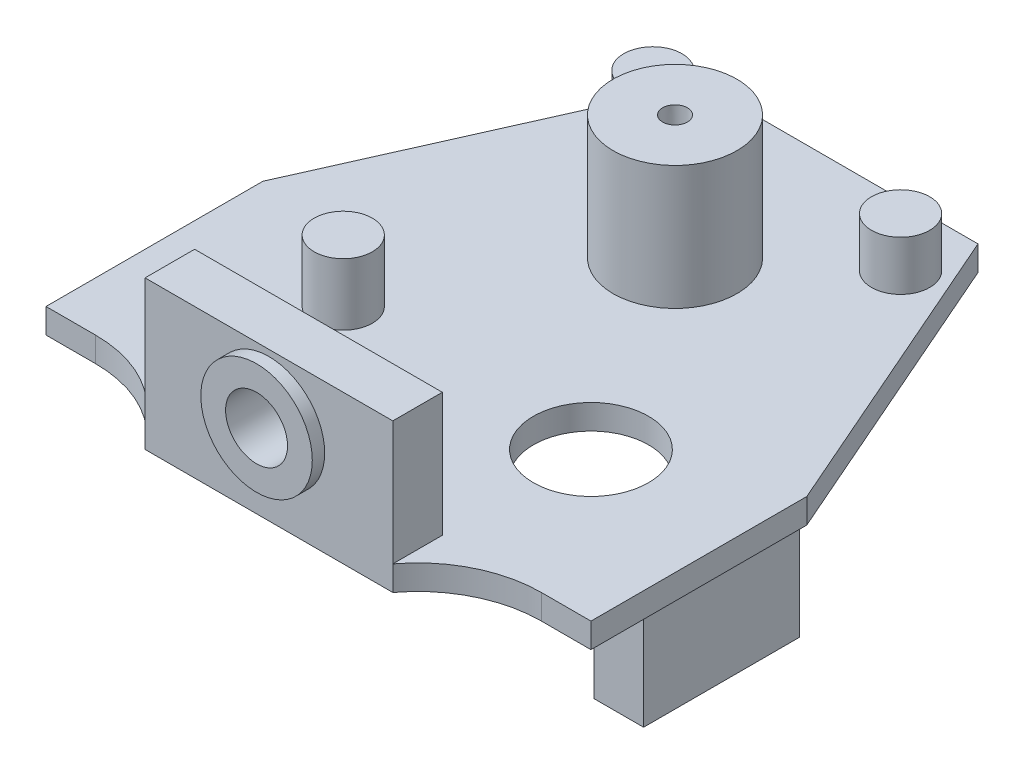
ISO-10303-21;
HEADER;
FILE_DESCRIPTION(('STEP AP214'),'2;1');
FILE_NAME('part.step','',(''),(''),'','','');
FILE_SCHEMA(('AUTOMOTIVE_DESIGN { 1 0 10303 214 1 1 1 1 }'));
ENDSEC;
DATA;
#1=APPLICATION_CONTEXT('core data for automotive mechanical design processes');
#2=APPLICATION_PROTOCOL_DEFINITION('international standard','automotive_design',2000,#1);
#3=PRODUCT_CONTEXT('',#1,'mechanical');
#4=PRODUCT('Part','Part','',(#3));
#5=PRODUCT_RELATED_PRODUCT_CATEGORY('part','',(#4));
#6=PRODUCT_DEFINITION_FORMATION('','',#4);
#7=PRODUCT_DEFINITION_CONTEXT('part definition',#1,'design');
#8=PRODUCT_DEFINITION('design','',#6,#7);
#9=PRODUCT_DEFINITION_SHAPE('','',#8);
#10=(LENGTH_UNIT() NAMED_UNIT(*) SI_UNIT(.MILLI.,.METRE.));
#11=(NAMED_UNIT(*) PLANE_ANGLE_UNIT() SI_UNIT($,.RADIAN.));
#12=(NAMED_UNIT(*) SI_UNIT($,.STERADIAN.) SOLID_ANGLE_UNIT());
#13=UNCERTAINTY_MEASURE_WITH_UNIT(LENGTH_MEASURE(1.E-05),#10,'distance_accuracy_value','');
#14=(GEOMETRIC_REPRESENTATION_CONTEXT(3) GLOBAL_UNCERTAINTY_ASSIGNED_CONTEXT((#13)) GLOBAL_UNIT_ASSIGNED_CONTEXT((#10,
#11,#12)) REPRESENTATION_CONTEXT('',''));
#15=CARTESIAN_POINT('',(0.,0.,0.));
#16=DIRECTION('',(0.,0.,1.));
#17=DIRECTION('',(1.,0.,0.));
#18=AXIS2_PLACEMENT_3D('',#15,#16,#17);
#19=CARTESIAN_POINT('',(0.,0.,16.));
#20=DIRECTION('',(0.,0.,1.));
#21=DIRECTION('',(1.,0.,0.));
#22=AXIS2_PLACEMENT_3D('',#19,#20,#21);
#23=PLANE('',#22);
#24=DIRECTION('',(0.,-1.,0.));
#25=VECTOR('',#24,1.);
#26=CARTESIAN_POINT('',(-10.,2.,16.));
#27=LINE('',#26,#25);
#28=CARTESIAN_POINT('',(-10.,12.,16.));
#29=VERTEX_POINT('',#28);
#30=CARTESIAN_POINT('',(-10.,2.,16.));
#31=VERTEX_POINT('',#30);
#32=EDGE_CURVE('E183',#29,#31,#27,.T.);
#33=ORIENTED_EDGE('',*,*,#32,.T.);
#34=CARTESIAN_POINT('',(-10.,0.,16.));
#35=VERTEX_POINT('',#34);
#36=EDGE_CURVE('E192',#31,#35,#27,.T.);
#37=ORIENTED_EDGE('',*,*,#36,.T.);
#38=DIRECTION('',(1.,0.,0.));
#39=VECTOR('',#38,1.);
#40=CARTESIAN_POINT('',(-10.,0.,16.));
#41=LINE('',#40,#39);
#42=CARTESIAN_POINT('',(10.,0.,16.));
#43=VERTEX_POINT('',#42);
#44=EDGE_CURVE('E191',#35,#43,#41,.T.);
#45=ORIENTED_EDGE('',*,*,#44,.T.);
#46=DIRECTION('',(0.,1.,0.));
#47=VECTOR('',#46,1.);
#48=CARTESIAN_POINT('',(10.,2.,16.));
#49=LINE('',#48,#47);
#50=CARTESIAN_POINT('',(10.,2.,16.));
#51=VERTEX_POINT('',#50);
#52=EDGE_CURVE('E225',#43,#51,#49,.T.);
#53=ORIENTED_EDGE('',*,*,#52,.T.);
#54=CARTESIAN_POINT('',(10.,12.,16.));
#55=VERTEX_POINT('',#54);
#56=EDGE_CURVE('E199',#51,#55,#49,.T.);
#57=ORIENTED_EDGE('',*,*,#56,.T.);
#58=DIRECTION('',(1.,0.,0.));
#59=VECTOR('',#58,1.);
#60=CARTESIAN_POINT('',(-10.,12.,16.));
#61=LINE('',#60,#59);
#62=EDGE_CURVE('E195',#29,#55,#61,.T.);
#63=ORIENTED_EDGE('',*,*,#62,.F.);
#64=EDGE_LOOP('',(#33,#37,#45,#53,#57,#63));
#65=FACE_BOUND('',#64,.T.);
#66=CARTESIAN_POINT('',(0.,7.,16.));
#67=DIRECTION('',(0.,0.,1.));
#68=DIRECTION('',(1.,0.,0.));
#69=AXIS2_PLACEMENT_3D('',#66,#67,#68);
#70=CIRCLE('',#69,4.5);
#71=CARTESIAN_POINT('',(4.5,7.,16.));
#72=VERTEX_POINT('',#71);
#73=EDGE_CURVE('E817',#72,#72,#70,.T.);
#74=ORIENTED_EDGE('',*,*,#73,.F.);
#75=EDGE_LOOP('',(#74));
#76=FACE_BOUND('',#75,.T.);
#77=ADVANCED_FACE('F39',(#65,#76),#23,.T.);
#78=CARTESIAN_POINT('',(0.,7.,16.));
#79=DIRECTION('',(0.,0.,-1.));
#80=DIRECTION('',(-1.,0.,0.));
#81=AXIS2_PLACEMENT_3D('',#78,#79,#80);
#82=CYLINDRICAL_SURFACE('',#81,1.);
#83=CARTESIAN_POINT('',(0.,7.,12.));
#84=DIRECTION('',(0.,0.,-1.));
#85=DIRECTION('',(-1.,0.,0.));
#86=AXIS2_PLACEMENT_3D('',#83,#84,#85);
#87=CIRCLE('',#86,1.);
#88=CARTESIAN_POINT('',(-1.,7.,12.));
#89=VERTEX_POINT('',#88);
#90=EDGE_CURVE('E211',#89,#89,#87,.T.);
#91=ORIENTED_EDGE('',*,*,#90,.T.);
#92=EDGE_LOOP('',(#91));
#93=FACE_BOUND('',#92,.T.);
#94=CARTESIAN_POINT('',(0.,7.,13.));
#95=DIRECTION('',(0.,0.,1.));
#96=DIRECTION('',(1.,0.,0.));
#97=AXIS2_PLACEMENT_3D('',#94,#95,#96);
#98=CIRCLE('',#97,1.);
#99=CARTESIAN_POINT('',(0.999999999999998,7.,13.));
#100=VERTEX_POINT('',#99);
#101=EDGE_CURVE('E43',#100,#100,#98,.F.);
#102=ORIENTED_EDGE('',*,*,#101,.F.);
#103=EDGE_LOOP('',(#102));
#104=FACE_BOUND('',#103,.T.);
#105=ADVANCED_FACE('F432',(#93,#104),#82,.F.);
#106=CARTESIAN_POINT('',(0.,2.,0.));
#107=DIRECTION('',(0.,1.,0.));
#108=DIRECTION('',(0.,0.,1.));
#109=AXIS2_PLACEMENT_3D('',#106,#107,#108);
#110=PLANE('',#109);
#111=CARTESIAN_POINT('',(0.,2.,-16.7877513366981));
#112=DIRECTION('',(0.,1.,0.));
#113=DIRECTION('',(0.,0.,1.));
#114=AXIS2_PLACEMENT_3D('',#111,#112,#113);
#115=CIRCLE('',#114,5.);
#116=CARTESIAN_POINT('',(0.,2.,-11.7877513366981));
#117=VERTEX_POINT('',#116);
#118=EDGE_CURVE('E311',#117,#117,#115,.T.);
#119=ORIENTED_EDGE('',*,*,#118,.F.);
#120=EDGE_LOOP('',(#119));
#121=FACE_BOUND('',#120,.T.);
#122=CARTESIAN_POINT('',(-10.,2.,0.));
#123=DIRECTION('',(0.,1.,0.));
#124=DIRECTION('',(0.,0.,1.));
#125=AXIS2_PLACEMENT_3D('',#122,#123,#124);
#126=CIRCLE('',#125,2.35);
#127=CARTESIAN_POINT('',(-10.,2.,2.35));
#128=VERTEX_POINT('',#127);
#129=EDGE_CURVE('E340',#128,#128,#126,.T.);
#130=ORIENTED_EDGE('',*,*,#129,.F.);
#131=EDGE_LOOP('',(#130));
#132=FACE_BOUND('',#131,.T.);
#133=CARTESIAN_POINT('',(10.,2.,0.));
#134=DIRECTION('',(0.,1.,0.));
#135=DIRECTION('',(0.,0.,1.));
#136=AXIS2_PLACEMENT_3D('',#133,#134,#135);
#137=CIRCLE('',#136,4.65);
#138=CARTESIAN_POINT('',(10.,2.,4.65));
#139=VERTEX_POINT('',#138);
#140=EDGE_CURVE('E362',#139,#139,#137,.T.);
#141=ORIENTED_EDGE('',*,*,#140,.F.);
#142=EDGE_LOOP('',(#141));
#143=FACE_BOUND('',#142,.T.);
#144=CARTESIAN_POINT('',(10.,2.,-25.));
#145=DIRECTION('',(0.,1.,0.));
#146=DIRECTION('',(0.,0.,1.));
#147=AXIS2_PLACEMENT_3D('',#144,#145,#146);
#148=CIRCLE('',#147,2.35);
#149=CARTESIAN_POINT('',(10.,2.,-22.65));
#150=VERTEX_POINT('',#149);
#151=EDGE_CURVE('E376',#150,#150,#148,.T.);
#152=ORIENTED_EDGE('',*,*,#151,.F.);
#153=EDGE_LOOP('',(#152));
#154=FACE_BOUND('',#153,.T.);
#155=CARTESIAN_POINT('',(-10.,2.,-25.));
#156=DIRECTION('',(0.,1.,0.));
#157=DIRECTION('',(0.,0.,1.));
#158=AXIS2_PLACEMENT_3D('',#155,#156,#157);
#159=CIRCLE('',#158,2.35);
#160=CARTESIAN_POINT('',(-10.,2.,-22.65));
#161=VERTEX_POINT('',#160);
#162=EDGE_CURVE('E375',#161,#161,#159,.T.);
#163=ORIENTED_EDGE('',*,*,#162,.F.);
#164=EDGE_LOOP('',(#163));
#165=FACE_BOUND('',#164,.T.);
#166=DIRECTION('',(1.,0.,0.));
#167=VECTOR('',#166,1.);
#168=CARTESIAN_POINT('',(20.,2.,12.));
#169=LINE('',#168,#167);
#170=CARTESIAN_POINT('',(-22.,2.,12.));
#171=VERTEX_POINT('',#170);
#172=CARTESIAN_POINT('',(-18.,2.,12.));
#173=VERTEX_POINT('',#172);
#174=EDGE_CURVE('E332',#171,#173,#169,.T.);
#175=ORIENTED_EDGE('',*,*,#174,.T.);
#176=CARTESIAN_POINT('',(-18.,2.,22.));
#177=DIRECTION('',(0.,1.,0.));
#178=DIRECTION('',(0.,0.,1.));
#179=AXIS2_PLACEMENT_3D('',#176,#177,#178);
#180=CIRCLE('',#179,10.);
#181=EDGE_CURVE('E11',#173,#31,#180,.F.);
#182=ORIENTED_EDGE('',*,*,#181,.T.);
#183=DIRECTION('',(0.,0.,1.));
#184=VECTOR('',#183,1.);
#185=CARTESIAN_POINT('',(-10.,2.,16.));
#186=LINE('',#185,#184);
#187=CARTESIAN_POINT('',(-10.,2.,12.));
#188=VERTEX_POINT('',#187);
#189=EDGE_CURVE('E54',#188,#31,#186,.T.);
#190=ORIENTED_EDGE('',*,*,#189,.F.);
#191=DIRECTION('',(-1.,0.,0.));
#192=VECTOR('',#191,1.);
#193=CARTESIAN_POINT('',(-10.,2.,12.));
#194=LINE('',#193,#192);
#195=CARTESIAN_POINT('',(10.,2.,12.));
#196=VERTEX_POINT('',#195);
#197=EDGE_CURVE('E208',#196,#188,#194,.T.);
#198=ORIENTED_EDGE('',*,*,#197,.F.);
#199=DIRECTION('',(0.,0.,-1.));
#200=VECTOR('',#199,1.);
#201=CARTESIAN_POINT('',(10.,2.,16.));
#202=LINE('',#201,#200);
#203=EDGE_CURVE('E388',#51,#196,#202,.T.);
#204=ORIENTED_EDGE('',*,*,#203,.F.);
#205=CARTESIAN_POINT('',(18.,2.,22.));
#206=DIRECTION('',(0.,1.,0.));
#207=DIRECTION('',(0.,0.,1.));
#208=AXIS2_PLACEMENT_3D('',#205,#206,#207);
#209=CIRCLE('',#208,10.);
#210=CARTESIAN_POINT('',(18.,2.,12.));
#211=VERTEX_POINT('',#210);
#212=EDGE_CURVE('E399',#51,#211,#209,.F.);
#213=ORIENTED_EDGE('',*,*,#212,.T.);
#214=CARTESIAN_POINT('',(22.,2.,12.));
#215=VERTEX_POINT('',#214);
#216=EDGE_CURVE('E331',#211,#215,#169,.T.);
#217=ORIENTED_EDGE('',*,*,#216,.T.);
#218=DIRECTION('',(0.,0.,-1.));
#219=VECTOR('',#218,1.);
#220=CARTESIAN_POINT('',(22.,2.,-5.42857142857232));
#221=LINE('',#220,#219);
#222=CARTESIAN_POINT('',(22.,2.,-5.42857142857232));
#223=VERTEX_POINT('',#222);
#224=EDGE_CURVE('E322',#215,#223,#221,.T.);
#225=ORIENTED_EDGE('',*,*,#224,.T.);
#226=DIRECTION('',(0.400818834019773,0.,0.91615733490216));
#227=VECTOR('',#226,1.);
#228=CARTESIAN_POINT('',(20.,2.,-10.));
#229=LINE('',#228,#227);
#230=CARTESIAN_POINT('',(11.2499999999983,2.,-30.));
#231=VERTEX_POINT('',#230);
#232=EDGE_CURVE('E358',#231,#223,#229,.T.);
#233=ORIENTED_EDGE('',*,*,#232,.F.);
#234=DIRECTION('',(-1.,0.,0.));
#235=VECTOR('',#234,1.);
#236=CARTESIAN_POINT('',(-20.,2.,-30.));
#237=LINE('',#236,#235);
#238=CARTESIAN_POINT('',(-11.1,2.,-30.));
#239=VERTEX_POINT('',#238);
#240=EDGE_CURVE('E382',#231,#239,#237,.T.);
#241=ORIENTED_EDGE('',*,*,#240,.T.);
#242=DIRECTION('',(0.406562268123199,0.,-0.913623074434156));
#243=VECTOR('',#242,1.);
#244=CARTESIAN_POINT('',(-11.1,2.,-30.));
#245=LINE('',#244,#243);
#246=CARTESIAN_POINT('',(-22.,2.,-5.505617977528));
#247=VERTEX_POINT('',#246);
#248=EDGE_CURVE('E352',#247,#239,#245,.T.);
#249=ORIENTED_EDGE('',*,*,#248,.F.);
#250=DIRECTION('',(0.,0.,1.));
#251=VECTOR('',#250,1.);
#252=CARTESIAN_POINT('',(-22.,2.,-5.505617977528));
#253=LINE('',#252,#251);
#254=EDGE_CURVE('E315',#247,#171,#253,.T.);
#255=ORIENTED_EDGE('',*,*,#254,.T.);
#256=EDGE_LOOP('',(#175,#182,#190,#198,#204,#213,#217,#225,#233,#241,#249,#255));
#257=FACE_BOUND('',#256,.T.);
#258=ADVANCED_FACE('F414',(#121,#132,#143,#154,#165,#257),#110,.T.);
#259=CARTESIAN_POINT('',(20.,0.,12.));
#260=DIRECTION('',(0.,0.,1.));
#261=DIRECTION('',(1.,0.,0.));
#262=AXIS2_PLACEMENT_3D('',#259,#260,#261);
#263=PLANE('',#262);
#264=DIRECTION('',(1.,0.,0.));
#265=VECTOR('',#264,1.);
#266=CARTESIAN_POINT('',(-20.,0.,12.));
#267=LINE('',#266,#265);
#268=CARTESIAN_POINT('',(-22.,0.,12.));
#269=VERTEX_POINT('',#268);
#270=CARTESIAN_POINT('',(-18.,0.,12.));
#271=VERTEX_POINT('',#270);
#272=EDGE_CURVE('E323',#269,#271,#267,.T.);
#273=ORIENTED_EDGE('',*,*,#272,.T.);
#274=DIRECTION('',(0.,1.,0.));
#275=VECTOR('',#274,1.);
#276=CARTESIAN_POINT('',(-18.,2.,12.));
#277=LINE('',#276,#275);
#278=EDGE_CURVE('E397',#271,#173,#277,.T.);
#279=ORIENTED_EDGE('',*,*,#278,.T.);
#280=ORIENTED_EDGE('',*,*,#174,.F.);
#281=DIRECTION('',(0.,1.,0.));
#282=VECTOR('',#281,1.);
#283=CARTESIAN_POINT('',(-22.,0.,12.));
#284=LINE('',#283,#282);
#285=EDGE_CURVE('E344',#269,#171,#284,.T.);
#286=ORIENTED_EDGE('',*,*,#285,.F.);
#287=EDGE_LOOP('',(#273,#279,#280,#286));
#288=FACE_BOUND('',#287,.T.);
#289=ADVANCED_FACE('F523',(#288),#263,.T.);
#290=CARTESIAN_POINT('',(0.,0.,0.));
#291=DIRECTION('',(0.,1.,0.));
#292=DIRECTION('',(0.,0.,1.));
#293=AXIS2_PLACEMENT_3D('',#290,#291,#292);
#294=PLANE('',#293);
#295=DIRECTION('',(0.,0.,-1.));
#296=VECTOR('',#295,1.);
#297=CARTESIAN_POINT('',(-11.5499999999692,0.,6.29999999998945));
#298=LINE('',#297,#296);
#299=CARTESIAN_POINT('',(-11.5499999999692,0.,6.29999999998945));
#300=VERTEX_POINT('',#299);
#301=CARTESIAN_POINT('',(-11.5499999999692,0.,-6.30000000001055));
#302=VERTEX_POINT('',#301);
#303=EDGE_CURVE('E272',#300,#302,#298,.T.);
#304=ORIENTED_EDGE('',*,*,#303,.F.);
#305=DIRECTION('',(-1.,0.,0.));
#306=VECTOR('',#305,1.);
#307=CARTESIAN_POINT('',(-11.5499999999692,0.,6.29999999998945));
#308=LINE('',#307,#306);
#309=CARTESIAN_POINT('',(-7.54999999996917,0.,6.29999999998945));
#310=VERTEX_POINT('',#309);
#311=EDGE_CURVE('E277',#310,#300,#308,.T.);
#312=ORIENTED_EDGE('',*,*,#311,.F.);
#313=DIRECTION('',(0.,0.,1.));
#314=VECTOR('',#313,1.);
#315=CARTESIAN_POINT('',(-7.54999999996917,0.,6.29999999998945));
#316=LINE('',#315,#314);
#317=CARTESIAN_POINT('',(-7.54999999996917,0.,-6.30000000001055));
#318=VERTEX_POINT('',#317);
#319=EDGE_CURVE('E289',#318,#310,#316,.T.);
#320=ORIENTED_EDGE('',*,*,#319,.F.);
#321=DIRECTION('',(1.,0.,0.));
#322=VECTOR('',#321,1.);
#323=CARTESIAN_POINT('',(-11.5499999999692,0.,-6.30000000001055));
#324=LINE('',#323,#322);
#325=EDGE_CURVE('E286',#302,#318,#324,.T.);
#326=ORIENTED_EDGE('',*,*,#325,.F.);
#327=EDGE_LOOP('',(#304,#312,#320,#326));
#328=FACE_BOUND('',#327,.T.);
#329=DIRECTION('',(0.400818834019773,0.,0.91615733490216));
#330=VECTOR('',#329,1.);
#331=CARTESIAN_POINT('',(20.,0.,-10.));
#332=LINE('',#331,#330);
#333=CARTESIAN_POINT('',(11.2499999999983,0.,-30.));
#334=VERTEX_POINT('',#333);
#335=CARTESIAN_POINT('',(22.,0.,-5.42857142857232));
#336=VERTEX_POINT('',#335);
#337=EDGE_CURVE('E355',#334,#336,#332,.T.);
#338=ORIENTED_EDGE('',*,*,#337,.T.);
#339=DIRECTION('',(0.,0.,-1.));
#340=VECTOR('',#339,1.);
#341=CARTESIAN_POINT('',(22.,0.,-5.42857142857232));
#342=LINE('',#341,#340);
#343=CARTESIAN_POINT('',(22.,0.,12.));
#344=VERTEX_POINT('',#343);
#345=EDGE_CURVE('E325',#344,#336,#342,.T.);
#346=ORIENTED_EDGE('',*,*,#345,.F.);
#347=CARTESIAN_POINT('',(18.,0.,12.));
#348=VERTEX_POINT('',#347);
#349=EDGE_CURVE('E321',#348,#344,#267,.T.);
#350=ORIENTED_EDGE('',*,*,#349,.F.);
#351=CARTESIAN_POINT('',(18.,0.,22.));
#352=DIRECTION('',(0.,1.,0.));
#353=DIRECTION('',(0.,0.,1.));
#354=AXIS2_PLACEMENT_3D('',#351,#352,#353);
#355=CIRCLE('',#354,10.);
#356=EDGE_CURVE('E401',#348,#43,#355,.T.);
#357=ORIENTED_EDGE('',*,*,#356,.T.);
#358=ORIENTED_EDGE('',*,*,#44,.F.);
#359=CARTESIAN_POINT('',(-18.,0.,22.));
#360=DIRECTION('',(0.,1.,0.));
#361=DIRECTION('',(0.,0.,1.));
#362=AXIS2_PLACEMENT_3D('',#359,#360,#361);
#363=CIRCLE('',#362,10.);
#364=EDGE_CURVE('E48',#35,#271,#363,.T.);
#365=ORIENTED_EDGE('',*,*,#364,.T.);
#366=ORIENTED_EDGE('',*,*,#272,.F.);
#367=DIRECTION('',(0.,0.,1.));
#368=VECTOR('',#367,1.);
#369=CARTESIAN_POINT('',(-22.,0.,-5.505617977528));
#370=LINE('',#369,#368);
#371=CARTESIAN_POINT('',(-22.,0.,-5.505617977528));
#372=VERTEX_POINT('',#371);
#373=EDGE_CURVE('E318',#372,#269,#370,.T.);
#374=ORIENTED_EDGE('',*,*,#373,.F.);
#375=DIRECTION('',(0.406562268123199,0.,-0.913623074434156));
#376=VECTOR('',#375,1.);
#377=CARTESIAN_POINT('',(-11.1,0.,-30.));
#378=LINE('',#377,#376);
#379=CARTESIAN_POINT('',(-11.1,0.,-30.));
#380=VERTEX_POINT('',#379);
#381=EDGE_CURVE('E363',#372,#380,#378,.T.);
#382=ORIENTED_EDGE('',*,*,#381,.T.);
#383=DIRECTION('',(-1.,0.,0.));
#384=VECTOR('',#383,1.);
#385=CARTESIAN_POINT('',(-20.,0.,-30.));
#386=LINE('',#385,#384);
#387=EDGE_CURVE('E385',#334,#380,#386,.T.);
#388=ORIENTED_EDGE('',*,*,#387,.F.);
#389=EDGE_LOOP('',(#338,#346,#350,#357,#358,#365,#366,#374,#382,#388));
#390=FACE_BOUND('',#389,.T.);
#391=CARTESIAN_POINT('',(10.,0.,0.));
#392=DIRECTION('',(0.,1.,0.));
#393=DIRECTION('',(0.,0.,1.));
#394=AXIS2_PLACEMENT_3D('',#391,#392,#393);
#395=CIRCLE('',#394,4.65);
#396=CARTESIAN_POINT('',(10.,0.,4.65));
#397=VERTEX_POINT('',#396);
#398=EDGE_CURVE('E371',#397,#397,#395,.T.);
#399=ORIENTED_EDGE('',*,*,#398,.T.);
#400=EDGE_LOOP('',(#399));
#401=FACE_BOUND('',#400,.T.);
#402=DIRECTION('',(0.,0.,1.));
#403=VECTOR('',#402,1.);
#404=CARTESIAN_POINT('',(20.5499999972739,0.,6.3001583617975));
#405=LINE('',#404,#403);
#406=CARTESIAN_POINT('',(20.5499999972739,0.,-6.29998085737452));
#407=VERTEX_POINT('',#406);
#408=CARTESIAN_POINT('',(20.5499999972739,0.,6.3001583617975));
#409=VERTEX_POINT('',#408);
#410=EDGE_CURVE('E235',#407,#409,#405,.T.);
#411=ORIENTED_EDGE('',*,*,#410,.F.);
#412=DIRECTION('',(1.,0.,0.));
#413=VECTOR('',#412,1.);
#414=CARTESIAN_POINT('',(20.5499999972739,0.,-6.29998085737452));
#415=LINE('',#414,#413);
#416=CARTESIAN_POINT('',(16.5499999972739,0.,-6.29998085737452));
#417=VERTEX_POINT('',#416);
#418=EDGE_CURVE('E244',#417,#407,#415,.T.);
#419=ORIENTED_EDGE('',*,*,#418,.F.);
#420=DIRECTION('',(0.,0.,-1.));
#421=VECTOR('',#420,1.);
#422=CARTESIAN_POINT('',(16.5499999972739,0.,6.3001583617975));
#423=LINE('',#422,#421);
#424=CARTESIAN_POINT('',(16.5499999972739,0.,6.3001583617975));
#425=VERTEX_POINT('',#424);
#426=EDGE_CURVE('E256',#425,#417,#423,.T.);
#427=ORIENTED_EDGE('',*,*,#426,.F.);
#428=DIRECTION('',(-1.,0.,0.));
#429=VECTOR('',#428,1.);
#430=CARTESIAN_POINT('',(20.5499999972739,0.,6.3001583617975));
#431=LINE('',#430,#429);
#432=EDGE_CURVE('E253',#409,#425,#431,.T.);
#433=ORIENTED_EDGE('',*,*,#432,.F.);
#434=EDGE_LOOP('',(#411,#419,#427,#433));
#435=FACE_BOUND('',#434,.T.);
#436=ADVANCED_FACE('F405',(#328,#390,#401,#435),#294,.F.);
#437=CARTESIAN_POINT('',(-20.,0.,-30.));
#438=DIRECTION('',(0.,0.,-1.));
#439=DIRECTION('',(-1.,0.,0.));
#440=AXIS2_PLACEMENT_3D('',#437,#438,#439);
#441=PLANE('',#440);
#442=DIRECTION('',(0.,1.,0.));
#443=VECTOR('',#442,1.);
#444=CARTESIAN_POINT('',(11.2499999999983,0.,-30.));
#445=LINE('',#444,#443);
#446=EDGE_CURVE('E357',#334,#231,#445,.T.);
#447=ORIENTED_EDGE('',*,*,#446,.F.);
#448=ORIENTED_EDGE('',*,*,#387,.T.);
#449=DIRECTION('',(0.,1.,0.));
#450=VECTOR('',#449,1.);
#451=CARTESIAN_POINT('',(-11.1,0.,-30.));
#452=LINE('',#451,#450);
#453=EDGE_CURVE('E360',#380,#239,#452,.T.);
#454=ORIENTED_EDGE('',*,*,#453,.T.);
#455=ORIENTED_EDGE('',*,*,#240,.F.);
#456=EDGE_LOOP('',(#447,#448,#454,#455));
#457=FACE_BOUND('',#456,.T.);
#458=ADVANCED_FACE('F561',(#457),#441,.T.);
#459=CARTESIAN_POINT('',(-10.,6.,-25.));
#460=DIRECTION('',(0.,-1.,0.));
#461=DIRECTION('',(0.,0.,-1.));
#462=AXIS2_PLACEMENT_3D('',#459,#460,#461);
#463=CYLINDRICAL_SURFACE('',#462,2.35);
#464=CARTESIAN_POINT('',(-10.,6.,-25.));
#465=DIRECTION('',(0.,1.,0.));
#466=DIRECTION('',(0.,0.,1.));
#467=AXIS2_PLACEMENT_3D('',#464,#465,#466);
#468=CIRCLE('',#467,2.35);
#469=CARTESIAN_POINT('',(-10.,6.,-22.65));
#470=VERTEX_POINT('',#469);
#471=EDGE_CURVE('E379',#470,#470,#468,.T.);
#472=ORIENTED_EDGE('',*,*,#471,.F.);
#473=EDGE_LOOP('',(#472));
#474=FACE_BOUND('',#473,.T.);
#475=ORIENTED_EDGE('',*,*,#162,.T.);
#476=EDGE_LOOP('',(#475));
#477=FACE_BOUND('',#476,.T.);
#478=ADVANCED_FACE('F557',(#474,#477),#463,.T.);
#479=CARTESIAN_POINT('',(-10.,6.,-25.));
#480=DIRECTION('',(0.,1.,0.));
#481=DIRECTION('',(0.,0.,1.));
#482=AXIS2_PLACEMENT_3D('',#479,#480,#481);
#483=PLANE('',#482);
#484=ORIENTED_EDGE('',*,*,#471,.T.);
#485=EDGE_LOOP('',(#484));
#486=FACE_BOUND('',#485,.T.);
#487=ADVANCED_FACE('F553',(#486),#483,.T.);
#488=CARTESIAN_POINT('',(10.,6.,-25.));
#489=DIRECTION('',(0.,-1.,0.));
#490=DIRECTION('',(0.,0.,-1.));
#491=AXIS2_PLACEMENT_3D('',#488,#489,#490);
#492=CYLINDRICAL_SURFACE('',#491,2.35);
#493=CARTESIAN_POINT('',(10.,6.,-25.));
#494=DIRECTION('',(0.,1.,0.));
#495=DIRECTION('',(0.,0.,1.));
#496=AXIS2_PLACEMENT_3D('',#493,#494,#495);
#497=CIRCLE('',#496,2.35);
#498=CARTESIAN_POINT('',(10.,6.,-22.65));
#499=VERTEX_POINT('',#498);
#500=EDGE_CURVE('E372',#499,#499,#497,.T.);
#501=ORIENTED_EDGE('',*,*,#500,.F.);
#502=EDGE_LOOP('',(#501));
#503=FACE_BOUND('',#502,.T.);
#504=ORIENTED_EDGE('',*,*,#151,.T.);
#505=EDGE_LOOP('',(#504));
#506=FACE_BOUND('',#505,.T.);
#507=ADVANCED_FACE('F549',(#503,#506),#492,.T.);
#508=CARTESIAN_POINT('',(10.,6.,-25.));
#509=DIRECTION('',(0.,1.,0.));
#510=DIRECTION('',(0.,0.,1.));
#511=AXIS2_PLACEMENT_3D('',#508,#509,#510);
#512=PLANE('',#511);
#513=ORIENTED_EDGE('',*,*,#500,.T.);
#514=EDGE_LOOP('',(#513));
#515=FACE_BOUND('',#514,.T.);
#516=ADVANCED_FACE('F545',(#515),#512,.T.);
#517=CARTESIAN_POINT('',(10.,-4.,0.));
#518=DIRECTION('',(0.,1.,0.));
#519=DIRECTION('',(0.,0.,1.));
#520=AXIS2_PLACEMENT_3D('',#517,#518,#519);
#521=CYLINDRICAL_SURFACE('',#520,4.65);
#522=ORIENTED_EDGE('',*,*,#140,.T.);
#523=EDGE_LOOP('',(#522));
#524=FACE_BOUND('',#523,.T.);
#525=ORIENTED_EDGE('',*,*,#398,.F.);
#526=EDGE_LOOP('',(#525));
#527=FACE_BOUND('',#526,.T.);
#528=ADVANCED_FACE('F541',(#524,#527),#521,.F.);
#529=CARTESIAN_POINT('',(-11.1,0.,-30.));
#530=DIRECTION('',(0.913623074434156,0.,0.406562268123199));
#531=DIRECTION('',(0.406562268123199,0.,-0.913623074434156));
#532=AXIS2_PLACEMENT_3D('',#529,#530,#531);
#533=PLANE('',#532);
#534=ORIENTED_EDGE('',*,*,#248,.T.);
#535=ORIENTED_EDGE('',*,*,#453,.F.);
#536=ORIENTED_EDGE('',*,*,#381,.F.);
#537=DIRECTION('',(0.,1.,0.));
#538=VECTOR('',#537,1.);
#539=CARTESIAN_POINT('',(-22.,0.,-5.505617977528));
#540=LINE('',#539,#538);
#541=EDGE_CURVE('E328',#372,#247,#540,.T.);
#542=ORIENTED_EDGE('',*,*,#541,.T.);
#543=EDGE_LOOP('',(#534,#535,#536,#542));
#544=FACE_BOUND('',#543,.T.);
#545=ADVANCED_FACE('F537',(#544),#533,.F.);
#546=CARTESIAN_POINT('',(20.,0.,-10.));
#547=DIRECTION('',(-0.91615733490216,0.,0.400818834019773));
#548=DIRECTION('',(0.400818834019773,0.,0.91615733490216));
#549=AXIS2_PLACEMENT_3D('',#546,#547,#548);
#550=PLANE('',#549);
#551=ORIENTED_EDGE('',*,*,#232,.T.);
#552=DIRECTION('',(0.,1.,0.));
#553=VECTOR('',#552,1.);
#554=CARTESIAN_POINT('',(22.,0.,-5.42857142857232));
#555=LINE('',#554,#553);
#556=EDGE_CURVE('E337',#336,#223,#555,.T.);
#557=ORIENTED_EDGE('',*,*,#556,.F.);
#558=ORIENTED_EDGE('',*,*,#337,.F.);
#559=ORIENTED_EDGE('',*,*,#446,.T.);
#560=EDGE_LOOP('',(#551,#557,#558,#559));
#561=FACE_BOUND('',#560,.T.);
#562=ADVANCED_FACE('F533',(#561),#550,.F.);
#563=CARTESIAN_POINT('',(-10.,7.,0.));
#564=DIRECTION('',(0.,-1.,0.));
#565=DIRECTION('',(0.,0.,-1.));
#566=AXIS2_PLACEMENT_3D('',#563,#564,#565);
#567=CYLINDRICAL_SURFACE('',#566,2.35);
#568=CARTESIAN_POINT('',(-10.,7.,0.));
#569=DIRECTION('',(0.,1.,0.));
#570=DIRECTION('',(0.,0.,1.));
#571=AXIS2_PLACEMENT_3D('',#568,#569,#570);
#572=CIRCLE('',#571,2.35);
#573=CARTESIAN_POINT('',(-10.,7.,2.35));
#574=VERTEX_POINT('',#573);
#575=EDGE_CURVE('E349',#574,#574,#572,.T.);
#576=ORIENTED_EDGE('',*,*,#575,.F.);
#577=EDGE_LOOP('',(#576));
#578=FACE_BOUND('',#577,.T.);
#579=ORIENTED_EDGE('',*,*,#129,.T.);
#580=EDGE_LOOP('',(#579));
#581=FACE_BOUND('',#580,.T.);
#582=ADVANCED_FACE('F529',(#578,#581),#567,.T.);
#583=CARTESIAN_POINT('',(-10.,7.,0.));
#584=DIRECTION('',(0.,1.,0.));
#585=DIRECTION('',(0.,0.,1.));
#586=AXIS2_PLACEMENT_3D('',#583,#584,#585);
#587=PLANE('',#586);
#588=ORIENTED_EDGE('',*,*,#575,.T.);
#589=EDGE_LOOP('',(#588));
#590=FACE_BOUND('',#589,.T.);
#591=ADVANCED_FACE('F518',(#590),#587,.T.);
#592=CARTESIAN_POINT('',(22.,0.,-5.42857142857232));
#593=DIRECTION('',(1.,0.,0.));
#594=DIRECTION('',(0.,0.,-1.));
#595=AXIS2_PLACEMENT_3D('',#592,#593,#594);
#596=PLANE('',#595);
#597=ORIENTED_EDGE('',*,*,#224,.F.);
#598=DIRECTION('',(0.,1.,0.));
#599=VECTOR('',#598,1.);
#600=CARTESIAN_POINT('',(22.,0.,12.));
#601=LINE('',#600,#599);
#602=EDGE_CURVE('E341',#344,#215,#601,.T.);
#603=ORIENTED_EDGE('',*,*,#602,.F.);
#604=ORIENTED_EDGE('',*,*,#345,.T.);
#605=ORIENTED_EDGE('',*,*,#556,.T.);
#606=EDGE_LOOP('',(#597,#603,#604,#605));
#607=FACE_BOUND('',#606,.T.);
#608=ADVANCED_FACE('F514',(#607),#596,.T.);
#609=ORIENTED_EDGE('',*,*,#216,.F.);
#610=DIRECTION('',(0.,-1.,0.));
#611=VECTOR('',#610,1.);
#612=CARTESIAN_POINT('',(18.,0.,12.));
#613=LINE('',#612,#611);
#614=EDGE_CURVE('E394',#211,#348,#613,.T.);
#615=ORIENTED_EDGE('',*,*,#614,.T.);
#616=ORIENTED_EDGE('',*,*,#349,.T.);
#617=ORIENTED_EDGE('',*,*,#602,.T.);
#618=EDGE_LOOP('',(#609,#615,#616,#617));
#619=FACE_BOUND('',#618,.T.);
#620=ADVANCED_FACE('F517',(#619),#263,.T.);
#621=CARTESIAN_POINT('',(-22.,0.,-5.505617977528));
#622=DIRECTION('',(-1.,0.,0.));
#623=DIRECTION('',(0.,0.,1.));
#624=AXIS2_PLACEMENT_3D('',#621,#622,#623);
#625=PLANE('',#624);
#626=ORIENTED_EDGE('',*,*,#254,.F.);
#627=ORIENTED_EDGE('',*,*,#541,.F.);
#628=ORIENTED_EDGE('',*,*,#373,.T.);
#629=ORIENTED_EDGE('',*,*,#285,.T.);
#630=EDGE_LOOP('',(#626,#627,#628,#629));
#631=FACE_BOUND('',#630,.T.);
#632=ADVANCED_FACE('F512',(#631),#625,.T.);
#633=CARTESIAN_POINT('',(0.,12.,-16.7877513366981));
#634=DIRECTION('',(0.,-1.,0.));
#635=DIRECTION('',(0.,0.,-1.));
#636=AXIS2_PLACEMENT_3D('',#633,#634,#635);
#637=CYLINDRICAL_SURFACE('',#636,5.);
#638=CARTESIAN_POINT('',(0.,12.,-16.7877513366981));
#639=DIRECTION('',(0.,1.,0.));
#640=DIRECTION('',(0.,0.,1.));
#641=AXIS2_PLACEMENT_3D('',#638,#639,#640);
#642=CIRCLE('',#641,5.);
#643=CARTESIAN_POINT('',(0.,12.,-11.7877513366981));
#644=VERTEX_POINT('',#643);
#645=EDGE_CURVE('E312',#644,#644,#642,.T.);
#646=ORIENTED_EDGE('',*,*,#645,.F.);
#647=EDGE_LOOP('',(#646));
#648=FACE_BOUND('',#647,.T.);
#649=ORIENTED_EDGE('',*,*,#118,.T.);
#650=EDGE_LOOP('',(#649));
#651=FACE_BOUND('',#650,.T.);
#652=ADVANCED_FACE('F508',(#648,#651),#637,.T.);
#653=CARTESIAN_POINT('',(0.,12.,-16.7877513366981));
#654=DIRECTION('',(0.,1.,0.));
#655=DIRECTION('',(0.,0.,1.));
#656=AXIS2_PLACEMENT_3D('',#653,#654,#655);
#657=PLANE('',#656);
#658=CARTESIAN_POINT('',(0.,12.,-16.7877513366981));
#659=DIRECTION('',(0.,1.,0.));
#660=DIRECTION('',(0.,0.,1.));
#661=AXIS2_PLACEMENT_3D('',#658,#659,#660);
#662=CIRCLE('',#661,1.);
#663=CARTESIAN_POINT('',(0.,12.,-15.7877513366981));
#664=VERTEX_POINT('',#663);
#665=EDGE_CURVE('E305',#664,#664,#662,.T.);
#666=ORIENTED_EDGE('',*,*,#665,.F.);
#667=EDGE_LOOP('',(#666));
#668=FACE_BOUND('',#667,.T.);
#669=ORIENTED_EDGE('',*,*,#645,.T.);
#670=EDGE_LOOP('',(#669));
#671=FACE_BOUND('',#670,.T.);
#672=ADVANCED_FACE('F504',(#668,#671),#657,.T.);
#673=CARTESIAN_POINT('',(0.,12.,-16.7877513366981));
#674=DIRECTION('',(0.,1.,0.));
#675=DIRECTION('',(0.,0.,1.));
#676=AXIS2_PLACEMENT_3D('',#673,#674,#675);
#677=CONICAL_SURFACE('',#676,1.,0.0174532925199433);
#678=CARTESIAN_POINT('',(0.,4.,-16.7877513366981));
#679=DIRECTION('',(0.,1.,0.));
#680=DIRECTION('',(0.,0.,1.));
#681=AXIS2_PLACEMENT_3D('',#678,#679,#680);
#682=CIRCLE('',#681,0.860359480574259);
#683=CARTESIAN_POINT('',(0.,4.,-15.9273918561239));
#684=VERTEX_POINT('',#683);
#685=EDGE_CURVE('E308',#684,#684,#682,.T.);
#686=ORIENTED_EDGE('',*,*,#685,.F.);
#687=EDGE_LOOP('',(#686));
#688=FACE_BOUND('',#687,.T.);
#689=ORIENTED_EDGE('',*,*,#665,.T.);
#690=EDGE_LOOP('',(#689));
#691=FACE_BOUND('',#690,.T.);
#692=ADVANCED_FACE('F500',(#688,#691),#677,.F.);
#693=CARTESIAN_POINT('',(0.,4.,-16.7877513366981));
#694=DIRECTION('',(0.,1.,0.));
#695=DIRECTION('',(0.,0.,1.));
#696=AXIS2_PLACEMENT_3D('',#693,#694,#695);
#697=PLANE('',#696);
#698=ORIENTED_EDGE('',*,*,#685,.T.);
#699=EDGE_LOOP('',(#698));
#700=FACE_BOUND('',#699,.T.);
#701=ADVANCED_FACE('F496',(#700),#697,.T.);
#702=CARTESIAN_POINT('',(-11.5499999999692,-9.,6.29999999998945));
#703=DIRECTION('',(1.,0.,0.));
#704=DIRECTION('',(0.,0.,-1.));
#705=AXIS2_PLACEMENT_3D('',#702,#703,#704);
#706=PLANE('',#705);
#707=ORIENTED_EDGE('',*,*,#303,.T.);
#708=DIRECTION('',(0.,1.,0.));
#709=VECTOR('',#708,1.);
#710=CARTESIAN_POINT('',(-11.5499999999692,-9.,-6.30000000001055));
#711=LINE('',#710,#709);
#712=CARTESIAN_POINT('',(-11.5499999999692,-9.,-6.30000000001055));
#713=VERTEX_POINT('',#712);
#714=EDGE_CURVE('E302',#713,#302,#711,.T.);
#715=ORIENTED_EDGE('',*,*,#714,.F.);
#716=DIRECTION('',(0.,0.,-1.));
#717=VECTOR('',#716,1.);
#718=CARTESIAN_POINT('',(-11.5499999999692,-9.,6.29999999998945));
#719=LINE('',#718,#717);
#720=CARTESIAN_POINT('',(-11.5499999999692,-9.,6.29999999998945));
#721=VERTEX_POINT('',#720);
#722=EDGE_CURVE('E273',#721,#713,#719,.T.);
#723=ORIENTED_EDGE('',*,*,#722,.F.);
#724=DIRECTION('',(0.,1.,0.));
#725=VECTOR('',#724,1.);
#726=CARTESIAN_POINT('',(-11.5499999999692,-9.,6.29999999998945));
#727=LINE('',#726,#725);
#728=EDGE_CURVE('E283',#721,#300,#727,.T.);
#729=ORIENTED_EDGE('',*,*,#728,.T.);
#730=EDGE_LOOP('',(#707,#715,#723,#729));
#731=FACE_BOUND('',#730,.T.);
#732=ADVANCED_FACE('F492',(#731),#706,.F.);
#733=CARTESIAN_POINT('',(-11.5499999999692,-9.,-6.30000000001055));
#734=DIRECTION('',(0.,0.,1.));
#735=DIRECTION('',(1.,0.,0.));
#736=AXIS2_PLACEMENT_3D('',#733,#734,#735);
#737=PLANE('',#736);
#738=ORIENTED_EDGE('',*,*,#325,.T.);
#739=DIRECTION('',(0.,1.,0.));
#740=VECTOR('',#739,1.);
#741=CARTESIAN_POINT('',(-7.54999999996917,-9.,-6.30000000001055));
#742=LINE('',#741,#740);
#743=CARTESIAN_POINT('',(-7.54999999996917,-9.,-6.30000000001055));
#744=VERTEX_POINT('',#743);
#745=EDGE_CURVE('E299',#744,#318,#742,.T.);
#746=ORIENTED_EDGE('',*,*,#745,.F.);
#747=DIRECTION('',(1.,0.,0.));
#748=VECTOR('',#747,1.);
#749=CARTESIAN_POINT('',(-11.5499999999692,-9.,-6.30000000001055));
#750=LINE('',#749,#748);
#751=EDGE_CURVE('E276',#713,#744,#750,.T.);
#752=ORIENTED_EDGE('',*,*,#751,.F.);
#753=ORIENTED_EDGE('',*,*,#714,.T.);
#754=EDGE_LOOP('',(#738,#746,#752,#753));
#755=FACE_BOUND('',#754,.T.);
#756=ADVANCED_FACE('F488',(#755),#737,.F.);
#757=CARTESIAN_POINT('',(-7.54999999996917,-9.,6.29999999998945));
#758=DIRECTION('',(-1.,0.,0.));
#759=DIRECTION('',(0.,0.,1.));
#760=AXIS2_PLACEMENT_3D('',#757,#758,#759);
#761=PLANE('',#760);
#762=ORIENTED_EDGE('',*,*,#319,.T.);
#763=DIRECTION('',(0.,1.,0.));
#764=VECTOR('',#763,1.);
#765=CARTESIAN_POINT('',(-7.54999999996917,-9.,6.29999999998945));
#766=LINE('',#765,#764);
#767=CARTESIAN_POINT('',(-7.54999999996917,-9.,6.29999999998945));
#768=VERTEX_POINT('',#767);
#769=EDGE_CURVE('E296',#768,#310,#766,.T.);
#770=ORIENTED_EDGE('',*,*,#769,.F.);
#771=DIRECTION('',(0.,0.,1.));
#772=VECTOR('',#771,1.);
#773=CARTESIAN_POINT('',(-7.54999999996917,-9.,6.29999999998945));
#774=LINE('',#773,#772);
#775=EDGE_CURVE('E279',#744,#768,#774,.T.);
#776=ORIENTED_EDGE('',*,*,#775,.F.);
#777=ORIENTED_EDGE('',*,*,#745,.T.);
#778=EDGE_LOOP('',(#762,#770,#776,#777));
#779=FACE_BOUND('',#778,.T.);
#780=ADVANCED_FACE('F484',(#779),#761,.F.);
#781=CARTESIAN_POINT('',(-11.5499999999692,-9.,6.29999999998945));
#782=DIRECTION('',(0.,0.,-1.));
#783=DIRECTION('',(-1.,0.,0.));
#784=AXIS2_PLACEMENT_3D('',#781,#782,#783);
#785=PLANE('',#784);
#786=ORIENTED_EDGE('',*,*,#311,.T.);
#787=ORIENTED_EDGE('',*,*,#728,.F.);
#788=DIRECTION('',(-1.,0.,0.));
#789=VECTOR('',#788,1.);
#790=CARTESIAN_POINT('',(-11.5499999999692,-9.,6.29999999998945));
#791=LINE('',#790,#789);
#792=EDGE_CURVE('E281',#768,#721,#791,.T.);
#793=ORIENTED_EDGE('',*,*,#792,.F.);
#794=ORIENTED_EDGE('',*,*,#769,.T.);
#795=EDGE_LOOP('',(#786,#787,#793,#794));
#796=FACE_BOUND('',#795,.T.);
#797=ADVANCED_FACE('F480',(#796),#785,.F.);
#798=CARTESIAN_POINT('',(0.,-9.,0.));
#799=DIRECTION('',(0.,-1.,0.));
#800=DIRECTION('',(0.,0.,-1.));
#801=AXIS2_PLACEMENT_3D('',#798,#799,#800);
#802=PLANE('',#801);
#803=CARTESIAN_POINT('',(-9.27499999999988,-9.,1.17961196366423E-13));
#804=DIRECTION('',(0.,-1.,0.));
#805=DIRECTION('',(0.,0.,-1.));
#806=AXIS2_PLACEMENT_3D('',#803,#804,#805);
#807=CIRCLE('',#806,1.);
#808=CARTESIAN_POINT('',(-9.27499999999988,-9.,-0.999999999999884));
#809=VERTEX_POINT('',#808);
#810=EDGE_CURVE('E227',#809,#809,#807,.T.);
#811=ORIENTED_EDGE('',*,*,#810,.F.);
#812=EDGE_LOOP('',(#811));
#813=FACE_BOUND('',#812,.T.);
#814=ORIENTED_EDGE('',*,*,#722,.T.);
#815=ORIENTED_EDGE('',*,*,#751,.T.);
#816=ORIENTED_EDGE('',*,*,#775,.T.);
#817=ORIENTED_EDGE('',*,*,#792,.T.);
#818=EDGE_LOOP('',(#814,#815,#816,#817));
#819=FACE_BOUND('',#818,.T.);
#820=ADVANCED_FACE('F476',(#813,#819),#802,.T.);
#821=CARTESIAN_POINT('',(20.5499999972739,-9.,6.3001583617975));
#822=DIRECTION('',(-1.,0.,0.));
#823=DIRECTION('',(0.,0.,1.));
#824=AXIS2_PLACEMENT_3D('',#821,#822,#823);
#825=PLANE('',#824);
#826=ORIENTED_EDGE('',*,*,#410,.T.);
#827=DIRECTION('',(0.,1.,0.));
#828=VECTOR('',#827,1.);
#829=CARTESIAN_POINT('',(20.5499999972739,-9.,6.3001583617975));
#830=LINE('',#829,#828);
#831=CARTESIAN_POINT('',(20.5499999972739,-9.,6.3001583617975));
#832=VERTEX_POINT('',#831);
#833=EDGE_CURVE('E269',#832,#409,#830,.T.);
#834=ORIENTED_EDGE('',*,*,#833,.F.);
#835=DIRECTION('',(0.,0.,1.));
#836=VECTOR('',#835,1.);
#837=CARTESIAN_POINT('',(20.5499999972739,-9.,6.3001583617975));
#838=LINE('',#837,#836);
#839=CARTESIAN_POINT('',(20.5499999972739,-9.,-6.29998085737452));
#840=VERTEX_POINT('',#839);
#841=EDGE_CURVE('E240',#840,#832,#838,.T.);
#842=ORIENTED_EDGE('',*,*,#841,.F.);
#843=DIRECTION('',(0.,1.,0.));
#844=VECTOR('',#843,1.);
#845=CARTESIAN_POINT('',(20.5499999972739,-9.,-6.29998085737452));
#846=LINE('',#845,#844);
#847=EDGE_CURVE('E250',#840,#407,#846,.T.);
#848=ORIENTED_EDGE('',*,*,#847,.T.);
#849=EDGE_LOOP('',(#826,#834,#842,#848));
#850=FACE_BOUND('',#849,.T.);
#851=ADVANCED_FACE('F472',(#850),#825,.F.);
#852=CARTESIAN_POINT('',(20.5499999972739,-9.,6.3001583617975));
#853=DIRECTION('',(0.,0.,-1.));
#854=DIRECTION('',(-1.,0.,0.));
#855=AXIS2_PLACEMENT_3D('',#852,#853,#854);
#856=PLANE('',#855);
#857=ORIENTED_EDGE('',*,*,#432,.T.);
#858=DIRECTION('',(0.,1.,0.));
#859=VECTOR('',#858,1.);
#860=CARTESIAN_POINT('',(16.5499999972739,-9.,6.3001583617975));
#861=LINE('',#860,#859);
#862=CARTESIAN_POINT('',(16.5499999972739,-9.,6.3001583617975));
#863=VERTEX_POINT('',#862);
#864=EDGE_CURVE('E266',#863,#425,#861,.T.);
#865=ORIENTED_EDGE('',*,*,#864,.F.);
#866=DIRECTION('',(-1.,0.,0.));
#867=VECTOR('',#866,1.);
#868=CARTESIAN_POINT('',(20.5499999972739,-9.,6.3001583617975));
#869=LINE('',#868,#867);
#870=EDGE_CURVE('E243',#832,#863,#869,.T.);
#871=ORIENTED_EDGE('',*,*,#870,.F.);
#872=ORIENTED_EDGE('',*,*,#833,.T.);
#873=EDGE_LOOP('',(#857,#865,#871,#872));
#874=FACE_BOUND('',#873,.T.);
#875=ADVANCED_FACE('F468',(#874),#856,.F.);
#876=CARTESIAN_POINT('',(16.5499999972739,-9.,6.3001583617975));
#877=DIRECTION('',(1.,0.,0.));
#878=DIRECTION('',(0.,0.,-1.));
#879=AXIS2_PLACEMENT_3D('',#876,#877,#878);
#880=PLANE('',#879);
#881=ORIENTED_EDGE('',*,*,#426,.T.);
#882=DIRECTION('',(0.,1.,0.));
#883=VECTOR('',#882,1.);
#884=CARTESIAN_POINT('',(16.5499999972739,-9.,-6.29998085737452));
#885=LINE('',#884,#883);
#886=CARTESIAN_POINT('',(16.5499999972739,-9.,-6.29998085737452));
#887=VERTEX_POINT('',#886);
#888=EDGE_CURVE('E263',#887,#417,#885,.T.);
#889=ORIENTED_EDGE('',*,*,#888,.F.);
#890=DIRECTION('',(0.,0.,-1.));
#891=VECTOR('',#890,1.);
#892=CARTESIAN_POINT('',(16.5499999972739,-9.,6.3001583617975));
#893=LINE('',#892,#891);
#894=EDGE_CURVE('E246',#863,#887,#893,.T.);
#895=ORIENTED_EDGE('',*,*,#894,.F.);
#896=ORIENTED_EDGE('',*,*,#864,.T.);
#897=EDGE_LOOP('',(#881,#889,#895,#896));
#898=FACE_BOUND('',#897,.T.);
#899=ADVANCED_FACE('F464',(#898),#880,.F.);
#900=CARTESIAN_POINT('',(20.5499999972739,-9.,-6.29998085737452));
#901=DIRECTION('',(0.,0.,1.));
#902=DIRECTION('',(1.,0.,0.));
#903=AXIS2_PLACEMENT_3D('',#900,#901,#902);
#904=PLANE('',#903);
#905=ORIENTED_EDGE('',*,*,#418,.T.);
#906=ORIENTED_EDGE('',*,*,#847,.F.);
#907=DIRECTION('',(1.,0.,0.));
#908=VECTOR('',#907,1.);
#909=CARTESIAN_POINT('',(20.5499999972739,-9.,-6.29998085737452));
#910=LINE('',#909,#908);
#911=EDGE_CURVE('E248',#887,#840,#910,.T.);
#912=ORIENTED_EDGE('',*,*,#911,.F.);
#913=ORIENTED_EDGE('',*,*,#888,.T.);
#914=EDGE_LOOP('',(#905,#906,#912,#913));
#915=FACE_BOUND('',#914,.T.);
#916=ADVANCED_FACE('F460',(#915),#904,.F.);
#917=CARTESIAN_POINT('',(0.,-9.,0.));
#918=DIRECTION('',(0.,1.,0.));
#919=DIRECTION('',(0.,0.,1.));
#920=AXIS2_PLACEMENT_3D('',#917,#918,#919);
#921=PLANE('',#920);
#922=CARTESIAN_POINT('',(18.2671315720021,-9.,0.0151281395306384));
#923=DIRECTION('',(0.,-1.,0.));
#924=DIRECTION('',(0.,0.,-1.));
#925=AXIS2_PLACEMENT_3D('',#922,#923,#924);
#926=CIRCLE('',#925,1.);
#927=CARTESIAN_POINT('',(18.2671315720021,-9.,-0.984871860469363));
#928=VERTEX_POINT('',#927);
#929=EDGE_CURVE('E228',#928,#928,#926,.T.);
#930=ORIENTED_EDGE('',*,*,#929,.F.);
#931=EDGE_LOOP('',(#930));
#932=FACE_BOUND('',#931,.T.);
#933=ORIENTED_EDGE('',*,*,#841,.T.);
#934=ORIENTED_EDGE('',*,*,#870,.T.);
#935=ORIENTED_EDGE('',*,*,#894,.T.);
#936=ORIENTED_EDGE('',*,*,#911,.T.);
#937=EDGE_LOOP('',(#933,#934,#935,#936));
#938=FACE_BOUND('',#937,.T.);
#939=ADVANCED_FACE('F450',(#932,#938),#921,.F.);
#940=CARTESIAN_POINT('',(18.2671315720021,-9.,0.0151281395306384));
#941=DIRECTION('',(0.,-1.,0.));
#942=DIRECTION('',(0.,0.,-1.));
#943=AXIS2_PLACEMENT_3D('',#940,#941,#942);
#944=CONICAL_SURFACE('',#943,1.,0.0174532925199433);
#945=CARTESIAN_POINT('',(18.2671315720021,-3.,0.0151281395306384));
#946=DIRECTION('',(0.,-1.,0.));
#947=DIRECTION('',(0.,0.,-1.));
#948=AXIS2_PLACEMENT_3D('',#945,#946,#947);
#949=CIRCLE('',#948,0.895269610430696);
#950=CARTESIAN_POINT('',(18.2671315720021,-3.,-0.880141470900057));
#951=VERTEX_POINT('',#950);
#952=EDGE_CURVE('E231',#951,#951,#949,.T.);
#953=ORIENTED_EDGE('',*,*,#952,.F.);
#954=EDGE_LOOP('',(#953));
#955=FACE_BOUND('',#954,.T.);
#956=ORIENTED_EDGE('',*,*,#929,.T.);
#957=EDGE_LOOP('',(#956));
#958=FACE_BOUND('',#957,.T.);
#959=ADVANCED_FACE('F446',(#955,#958),#944,.F.);
#960=CARTESIAN_POINT('',(18.2671315720021,-3.,0.0151281395306384));
#961=DIRECTION('',(0.,-1.,0.));
#962=DIRECTION('',(0.,0.,-1.));
#963=AXIS2_PLACEMENT_3D('',#960,#961,#962);
#964=PLANE('',#963);
#965=ORIENTED_EDGE('',*,*,#952,.T.);
#966=EDGE_LOOP('',(#965));
#967=FACE_BOUND('',#966,.T.);
#968=ADVANCED_FACE('F442',(#967),#964,.T.);
#969=CARTESIAN_POINT('',(-9.27499999999988,-9.,1.17961196366423E-13));
#970=DIRECTION('',(0.,-1.,0.));
#971=DIRECTION('',(0.,0.,-1.));
#972=AXIS2_PLACEMENT_3D('',#969,#970,#971);
#973=CONICAL_SURFACE('',#972,1.,0.0174532925199433);
#974=CARTESIAN_POINT('',(-9.27499999999988,-3.,1.17961196366423E-13));
#975=DIRECTION('',(0.,-1.,0.));
#976=DIRECTION('',(0.,0.,-1.));
#977=AXIS2_PLACEMENT_3D('',#974,#975,#976);
#978=CIRCLE('',#977,0.895269610430696);
#979=CARTESIAN_POINT('',(-9.27499999999988,-3.,-0.895269610430578));
#980=VERTEX_POINT('',#979);
#981=EDGE_CURVE('E232',#980,#980,#978,.T.);
#982=ORIENTED_EDGE('',*,*,#981,.F.);
#983=EDGE_LOOP('',(#982));
#984=FACE_BOUND('',#983,.T.);
#985=ORIENTED_EDGE('',*,*,#810,.T.);
#986=EDGE_LOOP('',(#985));
#987=FACE_BOUND('',#986,.T.);
#988=ADVANCED_FACE('F445',(#984,#987),#973,.F.);
#989=CARTESIAN_POINT('',(-9.27499999999988,-3.,1.17961196366423E-13));
#990=DIRECTION('',(0.,-1.,0.));
#991=DIRECTION('',(0.,0.,-1.));
#992=AXIS2_PLACEMENT_3D('',#989,#990,#991);
#993=PLANE('',#992);
#994=ORIENTED_EDGE('',*,*,#981,.T.);
#995=EDGE_LOOP('',(#994));
#996=FACE_BOUND('',#995,.T.);
#997=ADVANCED_FACE('F441',(#996),#993,.T.);
#998=CARTESIAN_POINT('',(-10.,2.,16.));
#999=DIRECTION('',(1.,0.,0.));
#1000=DIRECTION('',(0.,0.,-1.));
#1001=AXIS2_PLACEMENT_3D('',#998,#999,#1000);
#1002=PLANE('',#1001);
#1003=DIRECTION('',(0.,-1.,0.));
#1004=VECTOR('',#1003,1.);
#1005=CARTESIAN_POINT('',(-10.,12.,12.));
#1006=LINE('',#1005,#1004);
#1007=CARTESIAN_POINT('',(-10.,12.,12.));
#1008=VERTEX_POINT('',#1007);
#1009=EDGE_CURVE('E217',#1008,#188,#1006,.T.);
#1010=ORIENTED_EDGE('',*,*,#1009,.T.);
#1011=ORIENTED_EDGE('',*,*,#189,.T.);
#1012=ORIENTED_EDGE('',*,*,#32,.F.);
#1013=DIRECTION('',(0.,0.,1.));
#1014=VECTOR('',#1013,1.);
#1015=CARTESIAN_POINT('',(-10.,12.,16.));
#1016=LINE('',#1015,#1014);
#1017=EDGE_CURVE('E187',#1008,#29,#1016,.T.);
#1018=ORIENTED_EDGE('',*,*,#1017,.F.);
#1019=EDGE_LOOP('',(#1010,#1011,#1012,#1018));
#1020=FACE_BOUND('',#1019,.T.);
#1021=ADVANCED_FACE('F185',(#1020),#1002,.F.);
#1022=CARTESIAN_POINT('',(10.,2.,16.));
#1023=DIRECTION('',(-1.,0.,0.));
#1024=DIRECTION('',(0.,0.,1.));
#1025=AXIS2_PLACEMENT_3D('',#1022,#1023,#1024);
#1026=PLANE('',#1025);
#1027=ORIENTED_EDGE('',*,*,#56,.F.);
#1028=ORIENTED_EDGE('',*,*,#203,.T.);
#1029=DIRECTION('',(0.,-1.,0.));
#1030=VECTOR('',#1029,1.);
#1031=CARTESIAN_POINT('',(10.,12.,12.));
#1032=LINE('',#1031,#1030);
#1033=CARTESIAN_POINT('',(10.,12.,12.));
#1034=VERTEX_POINT('',#1033);
#1035=EDGE_CURVE('E220',#1034,#196,#1032,.T.);
#1036=ORIENTED_EDGE('',*,*,#1035,.F.);
#1037=DIRECTION('',(0.,0.,-1.));
#1038=VECTOR('',#1037,1.);
#1039=CARTESIAN_POINT('',(10.,12.,16.));
#1040=LINE('',#1039,#1038);
#1041=EDGE_CURVE('E202',#55,#1034,#1040,.T.);
#1042=ORIENTED_EDGE('',*,*,#1041,.F.);
#1043=EDGE_LOOP('',(#1027,#1028,#1036,#1042));
#1044=FACE_BOUND('',#1043,.T.);
#1045=ADVANCED_FACE('F417',(#1044),#1026,.F.);
#1046=CARTESIAN_POINT('',(-10.,12.,12.));
#1047=DIRECTION('',(0.,0.,1.));
#1048=DIRECTION('',(1.,0.,0.));
#1049=AXIS2_PLACEMENT_3D('',#1046,#1047,#1048);
#1050=PLANE('',#1049);
#1051=ORIENTED_EDGE('',*,*,#90,.F.);
#1052=EDGE_LOOP('',(#1051));
#1053=FACE_BOUND('',#1052,.T.);
#1054=ORIENTED_EDGE('',*,*,#197,.T.);
#1055=ORIENTED_EDGE('',*,*,#1009,.F.);
#1056=DIRECTION('',(-1.,0.,0.));
#1057=VECTOR('',#1056,1.);
#1058=CARTESIAN_POINT('',(-10.,12.,12.));
#1059=LINE('',#1058,#1057);
#1060=EDGE_CURVE('E206',#1034,#1008,#1059,.T.);
#1061=ORIENTED_EDGE('',*,*,#1060,.F.);
#1062=ORIENTED_EDGE('',*,*,#1035,.T.);
#1063=EDGE_LOOP('',(#1054,#1055,#1061,#1062));
#1064=FACE_BOUND('',#1063,.T.);
#1065=ADVANCED_FACE('F419',(#1053,#1064),#1050,.F.);
#1066=CARTESIAN_POINT('',(0.,12.,0.));
#1067=DIRECTION('',(0.,-1.,0.));
#1068=DIRECTION('',(0.,0.,-1.));
#1069=AXIS2_PLACEMENT_3D('',#1066,#1067,#1068);
#1070=PLANE('',#1069);
#1071=ORIENTED_EDGE('',*,*,#1017,.T.);
#1072=ORIENTED_EDGE('',*,*,#62,.T.);
#1073=ORIENTED_EDGE('',*,*,#1041,.T.);
#1074=ORIENTED_EDGE('',*,*,#1060,.T.);
#1075=EDGE_LOOP('',(#1071,#1072,#1073,#1074));
#1076=FACE_BOUND('',#1075,.T.);
#1077=ADVANCED_FACE('F204',(#1076),#1070,.F.);
#1078=CARTESIAN_POINT('',(18.,2.,22.));
#1079=DIRECTION('',(0.,1.,0.));
#1080=DIRECTION('',(0.,0.,1.));
#1081=AXIS2_PLACEMENT_3D('',#1078,#1079,#1080);
#1082=CYLINDRICAL_SURFACE('',#1081,10.);
#1083=ORIENTED_EDGE('',*,*,#356,.F.);
#1084=ORIENTED_EDGE('',*,*,#614,.F.);
#1085=ORIENTED_EDGE('',*,*,#212,.F.);
#1086=ORIENTED_EDGE('',*,*,#52,.F.);
#1087=EDGE_LOOP('',(#1083,#1084,#1085,#1086));
#1088=FACE_BOUND('',#1087,.T.);
#1089=ADVANCED_FACE('F411',(#1088),#1082,.F.);
#1090=CARTESIAN_POINT('',(-18.,2.,22.));
#1091=DIRECTION('',(0.,-1.,0.));
#1092=DIRECTION('',(0.,0.,-1.));
#1093=AXIS2_PLACEMENT_3D('',#1090,#1091,#1092);
#1094=CYLINDRICAL_SURFACE('',#1093,10.);
#1095=ORIENTED_EDGE('',*,*,#181,.F.);
#1096=ORIENTED_EDGE('',*,*,#278,.F.);
#1097=ORIENTED_EDGE('',*,*,#364,.F.);
#1098=ORIENTED_EDGE('',*,*,#36,.F.);
#1099=EDGE_LOOP('',(#1095,#1096,#1097,#1098));
#1100=FACE_BOUND('',#1099,.T.);
#1101=ADVANCED_FACE('F41',(#1100),#1094,.F.);
#1102=CARTESIAN_POINT('',(0.,7.,13.));
#1103=DIRECTION('',(0.,0.,1.));
#1104=DIRECTION('',(1.,0.,0.));
#1105=AXIS2_PLACEMENT_3D('',#1102,#1103,#1104);
#1106=PLANE('',#1105);
#1107=CARTESIAN_POINT('',(0.,7.,13.));
#1108=DIRECTION('',(0.,0.,1.));
#1109=DIRECTION('',(1.,0.,0.));
#1110=AXIS2_PLACEMENT_3D('',#1107,#1108,#1109);
#1111=CIRCLE('',#1110,2.5);
#1112=CARTESIAN_POINT('',(2.5,7.,13.));
#1113=VERTEX_POINT('',#1112);
#1114=EDGE_CURVE('E820',#1113,#1113,#1111,.T.);
#1115=ORIENTED_EDGE('',*,*,#1114,.T.);
#1116=EDGE_LOOP('',(#1115));
#1117=FACE_BOUND('',#1116,.T.);
#1118=ORIENTED_EDGE('',*,*,#101,.T.);
#1119=EDGE_LOOP('',(#1118));
#1120=FACE_BOUND('',#1119,.T.);
#1121=ADVANCED_FACE('F575',(#1117,#1120),#1106,.T.);
#1122=CARTESIAN_POINT('',(0.,7.,13.));
#1123=DIRECTION('',(0.,0.,1.));
#1124=DIRECTION('',(1.,0.,0.));
#1125=AXIS2_PLACEMENT_3D('',#1122,#1123,#1124);
#1126=CYLINDRICAL_SURFACE('',#1125,2.5);
#1127=ORIENTED_EDGE('',*,*,#1114,.F.);
#1128=EDGE_LOOP('',(#1127));
#1129=FACE_BOUND('',#1128,.T.);
#1130=CARTESIAN_POINT('',(0.,7.,17.));
#1131=DIRECTION('',(0.,0.,1.));
#1132=DIRECTION('',(1.,0.,0.));
#1133=AXIS2_PLACEMENT_3D('',#1130,#1131,#1132);
#1134=CIRCLE('',#1133,2.5);
#1135=CARTESIAN_POINT('',(2.5,7.,17.));
#1136=VERTEX_POINT('',#1135);
#1137=EDGE_CURVE('E818',#1136,#1136,#1134,.T.);
#1138=ORIENTED_EDGE('',*,*,#1137,.T.);
#1139=EDGE_LOOP('',(#1138));
#1140=FACE_BOUND('',#1139,.T.);
#1141=ADVANCED_FACE('F580',(#1129,#1140),#1126,.F.);
#1142=CARTESIAN_POINT('',(0.,7.,17.));
#1143=DIRECTION('',(0.,0.,1.));
#1144=DIRECTION('',(1.,0.,0.));
#1145=AXIS2_PLACEMENT_3D('',#1142,#1143,#1144);
#1146=PLANE('',#1145);
#1147=CARTESIAN_POINT('',(0.,7.,17.));
#1148=DIRECTION('',(0.,0.,1.));
#1149=DIRECTION('',(1.,0.,0.));
#1150=AXIS2_PLACEMENT_3D('',#1147,#1148,#1149);
#1151=CIRCLE('',#1150,4.5);
#1152=CARTESIAN_POINT('',(4.5,7.,17.));
#1153=VERTEX_POINT('',#1152);
#1154=EDGE_CURVE('E814',#1153,#1153,#1151,.T.);
#1155=ORIENTED_EDGE('',*,*,#1154,.T.);
#1156=EDGE_LOOP('',(#1155));
#1157=FACE_BOUND('',#1156,.T.);
#1158=ORIENTED_EDGE('',*,*,#1137,.F.);
#1159=EDGE_LOOP('',(#1158));
#1160=FACE_BOUND('',#1159,.T.);
#1161=ADVANCED_FACE('F784',(#1157,#1160),#1146,.T.);
#1162=CARTESIAN_POINT('',(0.,7.,17.));
#1163=DIRECTION('',(0.,0.,-1.));
#1164=DIRECTION('',(-1.,0.,0.));
#1165=AXIS2_PLACEMENT_3D('',#1162,#1163,#1164);
#1166=CYLINDRICAL_SURFACE('',#1165,4.5);
#1167=ORIENTED_EDGE('',*,*,#1154,.F.);
#1168=EDGE_LOOP('',(#1167));
#1169=FACE_BOUND('',#1168,.T.);
#1170=ORIENTED_EDGE('',*,*,#73,.T.);
#1171=EDGE_LOOP('',(#1170));
#1172=FACE_BOUND('',#1171,.T.);
#1173=ADVANCED_FACE('F794',(#1169,#1172),#1166,.T.);
#1174=CLOSED_SHELL('',(#77,#105,#258,#289,#436,#458,#478,#487,#507,#516,#528,#545,#562,#582,
#591,#608,#620,#632,#652,#672,#692,#701,#732,#756,#780,#797,#820,#851,#875,#899,#916,#939,#959,
#968,#988,#997,#1021,#1045,#1065,#1077,#1089,#1101,#1121,#1141,#1161,#1173));
#1175=MANIFOLD_SOLID_BREP('B2',#1174);
#1176=ADVANCED_BREP_SHAPE_REPRESENTATION('',(#18,#1175),#14);
#1177=SHAPE_DEFINITION_REPRESENTATION(#9,#1176);
ENDSEC;
END-ISO-10303-21;
